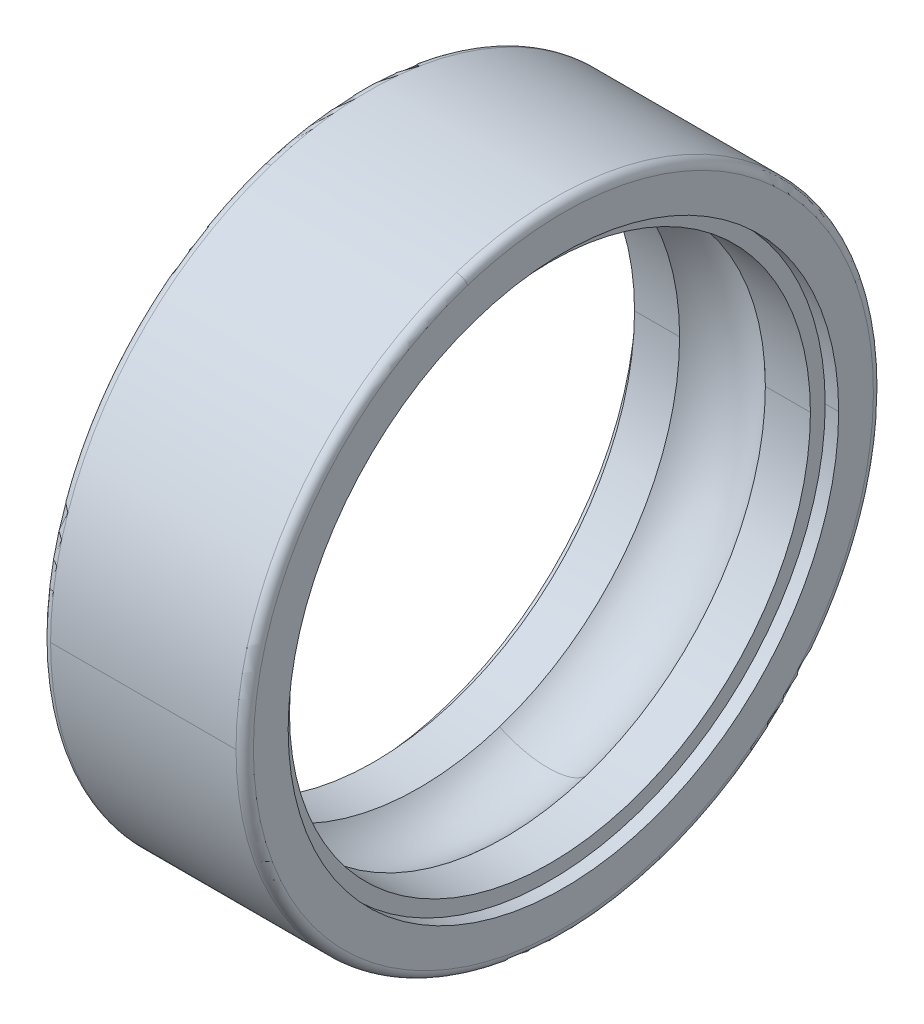
ISO-10303-21;
HEADER;
FILE_DESCRIPTION(('STEP AP214'),'2;1');
FILE_NAME('part.step','',(''),(''),'','','');
FILE_SCHEMA(('AUTOMOTIVE_DESIGN { 1 0 10303 214 1 1 1 1 }'));
ENDSEC;
DATA;
#1=APPLICATION_CONTEXT('core data for automotive mechanical design processes');
#2=APPLICATION_PROTOCOL_DEFINITION('international standard','automotive_design',2000,#1);
#3=PRODUCT_CONTEXT('',#1,'mechanical');
#4=PRODUCT('Part','Part','',(#3));
#5=PRODUCT_RELATED_PRODUCT_CATEGORY('part','',(#4));
#6=PRODUCT_DEFINITION_FORMATION('','',#4);
#7=PRODUCT_DEFINITION_CONTEXT('part definition',#1,'design');
#8=PRODUCT_DEFINITION('design','',#6,#7);
#9=PRODUCT_DEFINITION_SHAPE('','',#8);
#10=(LENGTH_UNIT() NAMED_UNIT(*) SI_UNIT(.MILLI.,.METRE.));
#11=(NAMED_UNIT(*) PLANE_ANGLE_UNIT() SI_UNIT($,.RADIAN.));
#12=(NAMED_UNIT(*) SI_UNIT($,.STERADIAN.) SOLID_ANGLE_UNIT());
#13=UNCERTAINTY_MEASURE_WITH_UNIT(LENGTH_MEASURE(1.E-05),#10,'distance_accuracy_value','');
#14=(GEOMETRIC_REPRESENTATION_CONTEXT(3) GLOBAL_UNCERTAINTY_ASSIGNED_CONTEXT((#13)) GLOBAL_UNIT_ASSIGNED_CONTEXT((#10,
#11,#12)) REPRESENTATION_CONTEXT('',''));
#15=CARTESIAN_POINT('',(0.,0.,0.));
#16=DIRECTION('',(0.,0.,1.));
#17=DIRECTION('',(1.,0.,0.));
#18=AXIS2_PLACEMENT_3D('',#15,#16,#17);
#19=CARTESIAN_POINT('',(0.,10.7,0.));
#20=DIRECTION('',(-1.,0.,0.));
#21=DIRECTION('',(0.,0.,1.));
#22=AXIS2_PLACEMENT_3D('',#19,#20,#21);
#23=PLANE('',#22);
#24=CARTESIAN_POINT('',(0.,0.,0.));
#25=DIRECTION('',(1.,0.,0.));
#26=DIRECTION('',(0.,0.,-1.));
#27=AXIS2_PLACEMENT_3D('',#24,#25,#26);
#28=CIRCLE('',#27,9.5);
#29=CARTESIAN_POINT('',(0.,0.,-9.5));
#30=VERTEX_POINT('',#29);
#31=CARTESIAN_POINT('',(0.,0.,9.5));
#32=VERTEX_POINT('',#31);
#33=EDGE_CURVE('E11',#30,#32,#28,.T.);
#34=ORIENTED_EDGE('',*,*,#33,.T.);
#35=CARTESIAN_POINT('',(0.,0.,0.));
#36=DIRECTION('',(1.,0.,0.));
#37=DIRECTION('',(0.,0.,-1.));
#38=AXIS2_PLACEMENT_3D('',#35,#36,#37);
#39=CIRCLE('',#38,9.5);
#40=EDGE_CURVE('E26',#32,#30,#39,.T.);
#41=ORIENTED_EDGE('',*,*,#40,.T.);
#42=EDGE_LOOP('',(#34,#41));
#43=FACE_BOUND('',#42,.T.);
#44=CARTESIAN_POINT('',(0.,10.1763047243581,3.30648183981196));
#45=CARTESIAN_POINT('',(0.,10.1222060192153,3.4729925522832));
#46=CARTESIAN_POINT('',(0.,10.0640137178569,3.63817284244062));
#47=CARTESIAN_POINT('',(0.,9.93959737326859,3.96548044496034));
#48=CARTESIAN_POINT('',(0.,9.87337333003879,4.12760775732264));
#49=CARTESIAN_POINT('',(0.,9.73304895226789,4.44841727108463));
#50=CARTESIAN_POINT('',(0.,9.65894861772679,4.60709947248432));
#51=CARTESIAN_POINT('',(0.,9.5030512671633,4.92063690146475));
#52=CARTESIAN_POINT('',(0.,9.42125425114093,5.07549212904549));
#53=CARTESIAN_POINT('',(0.,9.2501603002169,5.38100243898939));
#54=CARTESIAN_POINT('',(0.,9.16086336531526,5.53165752135256));
#55=CARTESIAN_POINT('',(0.,8.97498477943333,5.82840462947298));
#56=CARTESIAN_POINT('',(0.,8.87840312845304,5.97449665523024));
#57=CARTESIAN_POINT('',(0.,8.67818776299292,6.26176569364071));
#58=CARTESIAN_POINT('',(0.,8.57455404851308,6.40294270629393));
#59=CARTESIAN_POINT('',(0.,8.36048422439702,6.68004161285399));
#60=CARTESIAN_POINT('',(0.,8.25004811476079,6.81596350676083));
#61=CARTESIAN_POINT('',(0.,8.02263954907983,7.08222472750514));
#62=CARTESIAN_POINT('',(0.,7.90566709303509,7.2125640543426));
#63=CARTESIAN_POINT('',(0.,7.66546763183478,7.46734614224756));
#64=CARTESIAN_POINT('',(0.,7.5422406266792,7.59178890331505));
#65=CARTESIAN_POINT('',(0.,7.28982893179738,7.83447806612745));
#66=CARTESIAN_POINT('',(0.,7.16064424207114,7.95272446787235));
#67=CARTESIAN_POINT('',(0.,6.89662839530991,8.18273604611169));
#68=CARTESIAN_POINT('',(0.,6.76179723827492,8.29450122260611));
#69=CARTESIAN_POINT('',(0.,6.48681327695549,8.51128109824186));
#70=CARTESIAN_POINT('',(0.,6.34666047267106,8.61629579738319));
#71=CARTESIAN_POINT('',(0.,6.0613708572363,8.81932172870511));
#72=CARTESIAN_POINT('',(0.,5.91623404608597,8.91733296088571));
#73=CARTESIAN_POINT('',(0.,5.6213260642094,9.10611584064285));
#74=CARTESIAN_POINT('',(0.,5.47155489348316,9.19688748821941));
#75=CARTESIAN_POINT('',(0.,5.1677390043236,9.37097252191886));
#76=CARTESIAN_POINT('',(0.,5.01369428589029,9.45428590804176));
#77=CARTESIAN_POINT('',(0.,4.70170240853597,9.61325370958933));
#78=CARTESIAN_POINT('',(0.,4.54375524961497,9.688908125014));
#79=CARTESIAN_POINT('',(0.,4.22433899982567,9.83237572705182));
#80=CARTESIAN_POINT('',(0.,4.06286990895737,9.90018891366497));
#81=CARTESIAN_POINT('',(0.,3.73679878845639,10.0278106901734));
#82=CARTESIAN_POINT('',(0.,3.57219675882372,10.0876192800688));
#83=CARTESIAN_POINT('',(0.,3.24025630150081,10.19908777901));
#84=CARTESIAN_POINT('',(0.,3.07291787381057,10.2507476880558));
#85=CARTESIAN_POINT('',(0.,2.73590775330198,10.3457943720523));
#86=CARTESIAN_POINT('',(0.,2.56623606048361,10.3891811470029));
#87=CARTESIAN_POINT('',(0.,2.22496816368822,10.4675770402677));
#88=CARTESIAN_POINT('',(0.,2.0533719597112,10.502586158582));
#89=CARTESIAN_POINT('',(0.,1.70866843088395,10.5641423985417));
#90=CARTESIAN_POINT('',(0.,1.53556110603371,10.5906895201872));
#91=CARTESIAN_POINT('',(0.,1.18825236616799,10.635257812468));
#92=CARTESIAN_POINT('',(0.,1.01405095115252,10.6532789831034));
#93=CARTESIAN_POINT('',(0.,0.664973697423329,10.6807519587855));
#94=CARTESIAN_POINT('',(0.,0.490097858709621,10.6902037638323));
#95=CARTESIAN_POINT('',(0.,0.140093048796752,10.700515238111));
#96=CARTESIAN_POINT('',(0.,-0.0350359224024079,10.7013749073429));
#97=CARTESIAN_POINT('',(0.,-0.385125096255075,10.6945000389733));
#98=CARTESIAN_POINT('',(0.,-0.560085298908583,10.6867655013719));
#99=CARTESIAN_POINT('',(0.,-0.909415441217051,10.6627208525142));
#100=CARTESIAN_POINT('',(0.,-1.08378538087201,10.646410741258));
#101=CARTESIAN_POINT('',(0.,-1.43151492472575,10.6052542375774));
#102=CARTESIAN_POINT('',(0.,-1.60487452892453,10.580407845153));
#103=CARTESIAN_POINT('',(0.,-1.95016576339489,10.5222386362717));
#104=CARTESIAN_POINT('',(0.,-2.12209739366647,10.4889158198147));
#105=CARTESIAN_POINT('',(0.,-2.46411848192566,10.4138740404519));
#106=CARTESIAN_POINT('',(0.,-2.63420793991328,10.372155077546));
#107=CARTESIAN_POINT('',(0.,-2.97213492320218,10.2804215099211));
#108=CARTESIAN_POINT('',(0.,-3.13997244850347,10.230406905202));
#109=CARTESIAN_POINT('',(0.,-3.47299123112044,10.1222025435143));
#110=CARTESIAN_POINT('',(0.,-3.63817248843612,10.0640127865456));
#111=CARTESIAN_POINT('',(0.,-3.96548079896482,9.93959830457988));
#112=CARTESIAN_POINT('',(0.,-4.12760785217784,9.87337357958291));
#113=CARTESIAN_POINT('',(0.,-4.4484171762294,9.73304870272379));
#114=CARTESIAN_POINT('',(0.,-4.60709944706793,9.65894855086165));
#115=CARTESIAN_POINT('',(0.,-4.92063692688112,9.50305133402845));
#116=CARTESIAN_POINT('',(0.,-5.07549213585578,9.42125426905739));
#117=CARTESIAN_POINT('',(0.,-5.38100243217909,9.25016028230045));
#118=CARTESIAN_POINT('',(0.,-5.53165751952774,9.16086336051456));
#119=CARTESIAN_POINT('',(0.,-5.82840463129779,8.97498478423404));
#120=CARTESIAN_POINT('',(0.,-5.97449665571919,8.87840312973939));
#121=CARTESIAN_POINT('',(0.,-6.26176569315174,8.67818776170658));
#122=CARTESIAN_POINT('',(0.,-6.4029427061629,8.57455404816841));
#123=CARTESIAN_POINT('',(0.,-6.68004161298499,8.3604842247417));
#124=CARTESIAN_POINT('',(0.,-6.81596350679593,8.25004811485316));
#125=CARTESIAN_POINT('',(0.,-7.08222472747002,8.02263954898748));
#126=CARTESIAN_POINT('',(0.,-7.21256405433319,7.90566709301036));
#127=CARTESIAN_POINT('',(0.,-7.46734614225696,7.66546763185953));
#128=CARTESIAN_POINT('',(0.,-7.59178890331756,7.54224062668583));
#129=CARTESIAN_POINT('',(0.,-7.83447806612492,7.28982893179075));
#130=CARTESIAN_POINT('',(0.,-7.95272446787167,7.16064424206937));
#131=CARTESIAN_POINT('',(0.,-8.18273604611236,6.89662839531169));
#132=CARTESIAN_POINT('',(0.,-8.29450122260629,6.7617972382754));
#133=CARTESIAN_POINT('',(0.,-8.51128109824167,6.48681327695502));
#134=CARTESIAN_POINT('',(0.,-8.61629579738313,6.34666047267094));
#135=CARTESIAN_POINT('',(0.,-8.81932172870515,6.06137085723643));
#136=CARTESIAN_POINT('',(0.,-8.91733296088571,5.91623404608601));
#137=CARTESIAN_POINT('',(0.,-9.10611584064283,5.62132606420938));
#138=CARTESIAN_POINT('',(0.,-9.1968874882194,5.47155489348316));
#139=CARTESIAN_POINT('',(0.,-9.37097252191886,5.16773900432363));
#140=CARTESIAN_POINT('',(0.,-9.45428590804176,5.0136942858903));
#141=CARTESIAN_POINT('',(0.,-9.61325370958932,4.70170240853598));
#142=CARTESIAN_POINT('',(0.,-9.68890812501399,4.54375524961498));
#143=CARTESIAN_POINT('',(0.,-9.83237572705183,4.22433899982568));
#144=CARTESIAN_POINT('',(0.,-9.900188913665,4.06286990895737));
#145=CARTESIAN_POINT('',(0.,-10.0278106901734,3.73679878845641));
#146=CARTESIAN_POINT('',(0.,-10.0876192800686,3.57219675882376));
#147=CARTESIAN_POINT('',(0.,-10.1990877790101,3.24025630150078));
#148=CARTESIAN_POINT('',(0.,-10.2507476880563,3.07291787381045));
#149=CARTESIAN_POINT('',(0.,-10.3457943720518,2.73590775330212));
#150=CARTESIAN_POINT('',(0.,-10.389181147001,2.56623606048412));
#151=CARTESIAN_POINT('',(0.,-10.4675770402695,2.22496816368773));
#152=CARTESIAN_POINT('',(0.,-10.5025861585888,2.05337195970936));
#153=CARTESIAN_POINT('',(0.,-10.5641423985349,1.70866843088582));
#154=CARTESIAN_POINT('',(0.,-10.5906895201616,1.53556110604065));
#155=CARTESIAN_POINT('',(0.,-10.6352578124936,1.18825236616106));
#156=CARTESIAN_POINT('',(0.,-10.6532789831988,1.01405095112664));
#157=CARTESIAN_POINT('',(0.,-10.6807519586902,0.66497369744922));
#158=CARTESIAN_POINT('',(0.,-10.6902037634764,0.49009785880623));
#159=CARTESIAN_POINT('',(0.,-10.7005152384668,0.140093048700162));
#160=CARTESIAN_POINT('',(0.,-10.7013749086709,-0.0350359227629166));
#161=CARTESIAN_POINT('',(0.,-10.6945000376453,-0.385125095894546));
#162=CARTESIAN_POINT('',(0.,-10.6867654964154,-0.560085297563097));
#163=CARTESIAN_POINT('',(0.,-10.6627208574707,-0.909415442562518));
#164=CARTESIAN_POINT('',(0.,-10.6464107597557,-1.08378538589339));
#165=CARTESIAN_POINT('',(0.,-10.6052542190797,-1.43151491970436));
#166=CARTESIAN_POINT('',(0.,-10.5804077761186,-1.60487451018446));
#167=CARTESIAN_POINT('',(0.,-10.5222387053061,-1.95016578213494));
#168=CARTESIAN_POINT('',(0.,-10.4889160774547,-2.12209746360532));
#169=CARTESIAN_POINT('',(0.,-10.413873782812,-2.46411841198679));
#170=CARTESIAN_POINT('',(0.,-10.3721541160207,-2.63420767889787));
#171=CARTESIAN_POINT('',(0.,-10.2804224714464,-2.97213518421757));
#172=CARTESIAN_POINT('',(0.,-10.2304104936632,-3.13997342262617));
#173=CARTESIAN_POINT('',(0.,-10.1763047243581,-3.30648183981194));
#174=B_SPLINE_CURVE_WITH_KNOTS('',3,(#44,#45,#46,#47,#48,#49,#50,#51,#52,#53,#54,#55,#56,#57,
#58,#59,#60,#61,#62,#63,#64,#65,#66,#67,#68,#69,#70,#71,#72,#73,#74,#75,#76,#77,#78,#79,#80,#81,
#82,#83,#84,#85,#86,#87,#88,#89,#90,#91,#92,#93,#94,#95,#96,#97,#98,#99,#100,#101,#102,#103,
#104,#105,#106,#107,#108,#109,#110,#111,#112,#113,#114,#115,#116,#117,#118,#119,#120,#121,#122,
#123,#124,#125,#126,#127,#128,#129,#130,#131,#132,#133,#134,#135,#136,#137,#138,#139,#140,#141,
#142,#143,#144,#145,#146,#147,#148,#149,#150,#151,#152,#153,#154,#155,#156,#157,#158,#159,#160,
#161,#162,#163,#164,#165,#166,#167,#168,#169,#170,#171,#172,#173),.UNSPECIFIED.,.F.,.F.,(4,2,2,
2,2,2,2,2,2,2,2,2,2,2,2,2,2,2,2,2,2,2,2,2,2,2,2,2,2,2,2,2,2,2,2,2,2,2,2,2,2,2,2,2,2,2,2,2,2,2,2,
2,2,2,2,2,2,2,2,2,2,2,2,2,4),(0.,0.52518229039032,1.05036458078064,1.57554687117097,
2.10072916156129,2.62591145195161,3.15109374234194,3.67627603273226,4.20145832312258,
4.7266406135129,5.25182290390323,5.77700519429355,6.30218748468387,6.82736977507419,
7.35255206546451,7.87773435585484,8.40291664624516,8.92809893663548,9.4532812270258,
9.97846351741613,10.5036458078064,11.0288280981968,11.5540103885871,12.0791926789774,
12.6043749693677,13.1295572597581,13.6547395501484,14.1799218405387,14.705104130929,
15.2302864213194,15.7554687117097,16.2806510021,16.8058332924903,17.3310155828806,
17.856197873271,18.3813801636613,18.9065624540516,19.4317447444419,19.9569270348323,
20.4821093252226,21.0072916156129,21.5324739060032,22.0576561963935,22.5828384867839,
23.1080207771742,23.6332030675645,24.1583853579548,24.6835676483452,25.2087499387355,
25.7339322291258,26.2591145195161,26.7842968099065,27.3094791002968,27.8346613906871,
28.3598436810774,28.8850259714678,29.4102082618581,29.9353905522484,30.4605728426387,
30.985755133029,31.5109374234194,32.0361197138097,32.5613020042,33.0864842945903,
33.6116665849807),.UNSPECIFIED.);
#175=CARTESIAN_POINT('',(0.,10.1763047243581,3.30648183981194));
#176=VERTEX_POINT('',#175);
#177=CARTESIAN_POINT('',(0.,-10.1763047243581,-3.30648183981193));
#178=VERTEX_POINT('',#177);
#179=EDGE_CURVE('E318',#176,#178,#174,.T.);
#180=ORIENTED_EDGE('',*,*,#179,.F.);
#181=CARTESIAN_POINT('',(0.,-10.1763047243581,-3.30648183981196));
#182=CARTESIAN_POINT('',(0.,-10.1222060192153,-3.4729925522832));
#183=CARTESIAN_POINT('',(0.,-10.0640137178569,-3.63817284244062));
#184=CARTESIAN_POINT('',(0.,-9.93959737326859,-3.96548044496034));
#185=CARTESIAN_POINT('',(0.,-9.87337333003879,-4.12760775732264));
#186=CARTESIAN_POINT('',(0.,-9.73304895226789,-4.44841727108463));
#187=CARTESIAN_POINT('',(0.,-9.65894861772679,-4.60709947248432));
#188=CARTESIAN_POINT('',(0.,-9.50305126716331,-4.92063690146475));
#189=CARTESIAN_POINT('',(0.,-9.42125425114093,-5.07549212904549));
#190=CARTESIAN_POINT('',(0.,-9.2501603002169,-5.38100243898939));
#191=CARTESIAN_POINT('',(0.,-9.16086336531526,-5.53165752135256));
#192=CARTESIAN_POINT('',(0.,-8.97498477943333,-5.82840462947298));
#193=CARTESIAN_POINT('',(0.,-8.87840312845305,-5.97449665523023));
#194=CARTESIAN_POINT('',(0.,-8.67818776299292,-6.2617656936407));
#195=CARTESIAN_POINT('',(0.,-8.57455404851308,-6.40294270629392));
#196=CARTESIAN_POINT('',(0.,-8.36048422439702,-6.68004161285398));
#197=CARTESIAN_POINT('',(0.,-8.2500481147608,-6.81596350676083));
#198=CARTESIAN_POINT('',(0.,-8.02263954907984,-7.08222472750514));
#199=CARTESIAN_POINT('',(0.,-7.9056670930351,-7.2125640543426));
#200=CARTESIAN_POINT('',(0.,-7.66546763183478,-7.46734614224755));
#201=CARTESIAN_POINT('',(0.,-7.5422406266792,-7.59178890331504));
#202=CARTESIAN_POINT('',(0.,-7.28982893179738,-7.83447806612744));
#203=CARTESIAN_POINT('',(0.,-7.16064424207114,-7.95272446787235));
#204=CARTESIAN_POINT('',(0.,-6.89662839530992,-8.18273604611168));
#205=CARTESIAN_POINT('',(0.,-6.76179723827492,-8.2945012226061));
#206=CARTESIAN_POINT('',(0.,-6.4868132769555,-8.51128109824185));
#207=CARTESIAN_POINT('',(0.,-6.34666047267107,-8.61629579738318));
#208=CARTESIAN_POINT('',(0.,-6.06137085723631,-8.81932172870511));
#209=CARTESIAN_POINT('',(0.,-5.91623404608598,-8.9173329608857));
#210=CARTESIAN_POINT('',(0.,-5.62132606420941,-9.10611584064285));
#211=CARTESIAN_POINT('',(0.,-5.47155489348317,-9.1968874882194));
#212=CARTESIAN_POINT('',(0.,-5.16773900432361,-9.37097252191885));
#213=CARTESIAN_POINT('',(0.,-5.0136942858903,-9.45428590804176));
#214=CARTESIAN_POINT('',(0.,-4.70170240853598,-9.61325370958933));
#215=CARTESIAN_POINT('',(0.,-4.54375524961498,-9.688908125014));
#216=CARTESIAN_POINT('',(0.,-4.22433899982568,-9.83237572705182));
#217=CARTESIAN_POINT('',(0.,-4.06286990895738,-9.90018891366496));
#218=CARTESIAN_POINT('',(0.,-3.7367987884564,-10.0278106901734));
#219=CARTESIAN_POINT('',(0.,-3.57219675882373,-10.0876192800688));
#220=CARTESIAN_POINT('',(0.,-3.24025630150082,-10.19908777901));
#221=CARTESIAN_POINT('',(0.,-3.07291787381059,-10.2507476880558));
#222=CARTESIAN_POINT('',(0.,-2.73590775330199,-10.3457943720523));
#223=CARTESIAN_POINT('',(0.,-2.56623606048362,-10.3891811470029));
#224=CARTESIAN_POINT('',(0.,-2.22496816368823,-10.4675770402677));
#225=CARTESIAN_POINT('',(0.,-2.05337195971121,-10.502586158582));
#226=CARTESIAN_POINT('',(0.,-1.70866843088396,-10.5641423985417));
#227=CARTESIAN_POINT('',(0.,-1.53556110603372,-10.5906895201872));
#228=CARTESIAN_POINT('',(0.,-1.18825236616801,-10.635257812468));
#229=CARTESIAN_POINT('',(0.,-1.01405095115253,-10.6532789831034));
#230=CARTESIAN_POINT('',(0.,-0.664973697423343,-10.6807519587855));
#231=CARTESIAN_POINT('',(0.,-0.490097858709633,-10.6902037638323));
#232=CARTESIAN_POINT('',(0.,-0.140093048796764,-10.700515238111));
#233=CARTESIAN_POINT('',(0.,0.035035922402394,-10.7013749073429));
#234=CARTESIAN_POINT('',(0.,0.38512509625506,-10.6945000389733));
#235=CARTESIAN_POINT('',(0.,0.560085298908567,-10.6867655013719));
#236=CARTESIAN_POINT('',(0.,0.909415441217034,-10.6627208525142));
#237=CARTESIAN_POINT('',(0.,1.08378538087199,-10.646410741258));
#238=CARTESIAN_POINT('',(0.,1.43151492472573,-10.6052542375774));
#239=CARTESIAN_POINT('',(0.,1.60487452892451,-10.580407845153));
#240=CARTESIAN_POINT('',(0.,1.95016576339487,-10.5222386362717));
#241=CARTESIAN_POINT('',(0.,2.12209739366645,-10.4889158198147));
#242=CARTESIAN_POINT('',(0.,2.46411848192564,-10.4138740404519));
#243=CARTESIAN_POINT('',(0.,2.63420793991326,-10.372155077546));
#244=CARTESIAN_POINT('',(0.,2.97213492320216,-10.2804215099211));
#245=CARTESIAN_POINT('',(0.,3.13997244850345,-10.230406905202));
#246=CARTESIAN_POINT('',(0.,3.47299123112042,-10.1222025435143));
#247=CARTESIAN_POINT('',(0.,3.6381724884361,-10.0640127865456));
#248=CARTESIAN_POINT('',(0.,3.9654807989648,-9.93959830457989));
#249=CARTESIAN_POINT('',(0.,4.12760785217782,-9.87337357958291));
#250=CARTESIAN_POINT('',(0.,4.44841717622938,-9.7330487027238));
#251=CARTESIAN_POINT('',(0.,4.60709944706791,-9.65894855086166));
#252=CARTESIAN_POINT('',(0.,4.9206369268811,-9.50305133402846));
#253=CARTESIAN_POINT('',(0.,5.07549213585576,-9.4212542690574));
#254=CARTESIAN_POINT('',(0.,5.38100243217907,-9.25016028230046));
#255=CARTESIAN_POINT('',(0.,5.53165751952772,-9.16086336051458));
#256=CARTESIAN_POINT('',(0.,5.82840463129777,-8.97498478423405));
#257=CARTESIAN_POINT('',(0.,5.97449665571916,-8.87840312973941));
#258=CARTESIAN_POINT('',(0.,6.26176569315172,-8.67818776170659));
#259=CARTESIAN_POINT('',(0.,6.40294270616288,-8.57455404816842));
#260=CARTESIAN_POINT('',(0.,6.68004161298497,-8.36048422474171));
#261=CARTESIAN_POINT('',(0.,6.81596350679591,-8.25004811485317));
#262=CARTESIAN_POINT('',(0.,7.08222472747001,-8.0226395489875));
#263=CARTESIAN_POINT('',(0.,7.21256405433317,-7.90566709301037));
#264=CARTESIAN_POINT('',(0.,7.46734614225694,-7.66546763185954));
#265=CARTESIAN_POINT('',(0.,7.59178890331754,-7.54224062668585));
#266=CARTESIAN_POINT('',(0.,7.8344780661249,-7.28982893179077));
#267=CARTESIAN_POINT('',(0.,7.95272446787165,-7.16064424206939));
#268=CARTESIAN_POINT('',(0.,8.18273604611234,-6.89662839531171));
#269=CARTESIAN_POINT('',(0.,8.29450122260627,-6.76179723827542));
#270=CARTESIAN_POINT('',(0.,8.51128109824166,-6.48681327695505));
#271=CARTESIAN_POINT('',(0.,8.61629579738312,-6.34666047267096));
#272=CARTESIAN_POINT('',(0.,8.81932172870514,-6.06137085723646));
#273=CARTESIAN_POINT('',(0.,8.9173329608857,-5.91623404608604));
#274=CARTESIAN_POINT('',(0.,9.10611584064282,-5.6213260642094));
#275=CARTESIAN_POINT('',(0.,9.19688748821938,-5.47155489348319));
#276=CARTESIAN_POINT('',(0.,9.37097252191884,-5.16773900432365));
#277=CARTESIAN_POINT('',(0.,9.45428590804174,-5.01369428589033));
#278=CARTESIAN_POINT('',(0.,9.61325370958931,-4.70170240853601));
#279=CARTESIAN_POINT('',(0.,9.68890812501398,-4.54375524961501));
#280=CARTESIAN_POINT('',(0.,9.83237572705182,-4.2243389998257));
#281=CARTESIAN_POINT('',(0.,9.90018891366499,-4.06286990895739));
#282=CARTESIAN_POINT('',(0.,10.0278106901734,-3.73679878845644));
#283=CARTESIAN_POINT('',(0.,10.0876192800686,-3.57219675882379));
#284=CARTESIAN_POINT('',(0.,10.1990877790101,-3.24025630150081));
#285=CARTESIAN_POINT('',(0.,10.2507476880563,-3.07291787381048));
#286=CARTESIAN_POINT('',(0.,10.3457943720518,-2.73590775330215));
#287=CARTESIAN_POINT('',(0.,10.389181147001,-2.56623606048414));
#288=CARTESIAN_POINT('',(0.,10.4675770402695,-2.22496816368776));
#289=CARTESIAN_POINT('',(0.,10.5025861585888,-2.05337195970938));
#290=CARTESIAN_POINT('',(0.,10.5641423985349,-1.70866843088585));
#291=CARTESIAN_POINT('',(0.,10.5906895201616,-1.53556110604069));
#292=CARTESIAN_POINT('',(0.,10.6352578124936,-1.1882523661611));
#293=CARTESIAN_POINT('',(0.,10.6532789831988,-1.01405095112668));
#294=CARTESIAN_POINT('',(0.,10.6807519586902,-0.66497369744926));
#295=CARTESIAN_POINT('',(0.,10.6902037634764,-0.490097858806269));
#296=CARTESIAN_POINT('',(0.,10.7005152384668,-0.140093048700201));
#297=CARTESIAN_POINT('',(0.,10.7013749086709,0.0350359227628772));
#298=CARTESIAN_POINT('',(0.,10.6945000376453,0.385125095894506));
#299=CARTESIAN_POINT('',(0.,10.6867654964154,0.560085297563057));
#300=CARTESIAN_POINT('',(0.,10.6627208574707,0.909415442562479));
#301=CARTESIAN_POINT('',(0.,10.6464107597557,1.08378538589335));
#302=CARTESIAN_POINT('',(0.,10.6052542190797,1.43151491970432));
#303=CARTESIAN_POINT('',(0.,10.5804077761186,1.60487451018442));
#304=CARTESIAN_POINT('',(0.,10.5222387053061,1.9501657821349));
#305=CARTESIAN_POINT('',(0.,10.4889160774547,2.12209746360528));
#306=CARTESIAN_POINT('',(0.,10.413873782812,2.46411841198675));
#307=CARTESIAN_POINT('',(0.,10.3721541160208,2.63420767889784));
#308=CARTESIAN_POINT('',(0.,10.2804224714464,2.97213518421753));
#309=CARTESIAN_POINT('',(0.,10.2304104936632,3.13997342262613));
#310=CARTESIAN_POINT('',(0.,10.1763047243582,3.30648183981191));
#311=B_SPLINE_CURVE_WITH_KNOTS('',3,(#181,#182,#183,#184,#185,#186,#187,#188,#189,#190,#191,
#192,#193,#194,#195,#196,#197,#198,#199,#200,#201,#202,#203,#204,#205,#206,#207,#208,#209,#210,
#211,#212,#213,#214,#215,#216,#217,#218,#219,#220,#221,#222,#223,#224,#225,#226,#227,#228,#229,
#230,#231,#232,#233,#234,#235,#236,#237,#238,#239,#240,#241,#242,#243,#244,#245,#246,#247,#248,
#249,#250,#251,#252,#253,#254,#255,#256,#257,#258,#259,#260,#261,#262,#263,#264,#265,#266,#267,
#268,#269,#270,#271,#272,#273,#274,#275,#276,#277,#278,#279,#280,#281,#282,#283,#284,#285,#286,
#287,#288,#289,#290,#291,#292,#293,#294,#295,#296,#297,#298,#299,#300,#301,#302,#303,#304,#305,
#306,#307,#308,#309,#310),.UNSPECIFIED.,.F.,.F.,(4,2,2,2,2,2,2,2,2,2,2,2,2,2,2,2,2,2,2,2,2,2,2,
2,2,2,2,2,2,2,2,2,2,2,2,2,2,2,2,2,2,2,2,2,2,2,2,2,2,2,2,2,2,2,2,2,2,2,2,2,2,2,2,2,4),(0.,
0.52518229039032,1.05036458078064,1.57554687117097,2.10072916156129,2.62591145195161,
3.15109374234193,3.67627603273225,4.20145832312258,4.7266406135129,5.25182290390322,
5.77700519429354,6.30218748468386,6.82736977507418,7.35255206546451,7.87773435585483,
8.40291664624515,8.92809893663547,9.4532812270258,9.97846351741612,10.5036458078064,
11.0288280981968,11.5540103885871,12.0791926789774,12.6043749693677,13.1295572597581,
13.6547395501484,14.1799218405387,14.705104130929,15.2302864213193,15.7554687117097,
16.2806510021,16.8058332924903,17.3310155828806,17.856197873271,18.3813801636613,
18.9065624540516,19.4317447444419,19.9569270348322,20.4821093252226,21.0072916156129,
21.5324739060032,22.0576561963935,22.5828384867838,23.1080207771742,23.6332030675645,
24.1583853579548,24.6835676483451,25.2087499387355,25.7339322291258,26.2591145195161,
26.7842968099064,27.3094791002968,27.8346613906871,28.3598436810774,28.8850259714677,
29.410208261858,29.9353905522484,30.4605728426387,30.985755133029,31.5109374234193,
32.0361197138097,32.5613020042,33.0864842945903,33.6116665849806),.UNSPECIFIED.);
#312=EDGE_CURVE('E420',#178,#176,#311,.T.);
#313=ORIENTED_EDGE('',*,*,#312,.F.);
#314=EDGE_LOOP('',(#180,#313));
#315=FACE_BOUND('',#314,.T.);
#316=ADVANCED_FACE('F17',(#43,#315),#23,.T.);
#317=CARTESIAN_POINT('',(0.299999999999936,0.,0.));
#318=DIRECTION('',(1.,0.,0.));
#319=DIRECTION('',(0.,-0.309016994374947,0.951056516295154));
#320=AXIS2_PLACEMENT_3D('',#317,#318,#319);
#321=TOROIDAL_SURFACE('',#320,10.7,0.299999999999936);
#322=CARTESIAN_POINT('',(0.299999999999936,-10.1763047243581,-3.30648183981193));
#323=DIRECTION('',(0.,0.309016994374948,-0.951056516295154));
#324=DIRECTION('',(2.11682523361907E-13,-0.951056516295154,-0.309016994374948));
#325=AXIS2_PLACEMENT_3D('',#322,#323,#324);
#326=CIRCLE('',#325,0.299999999999937);
#327=CARTESIAN_POINT('',(0.3,-10.4616216792466,-3.3991869381244));
#328=VERTEX_POINT('',#327);
#329=EDGE_CURVE('E383',#328,#178,#326,.T.);
#330=ORIENTED_EDGE('',*,*,#329,.T.);
#331=ORIENTED_EDGE('',*,*,#312,.T.);
#332=CARTESIAN_POINT('',(0.299999999999936,10.1763047243581,3.30648183981194));
#333=DIRECTION('',(0.,-0.309016994374948,0.951056516295154));
#334=DIRECTION('',(2.11682523361907E-13,0.951056516295154,0.309016994374948));
#335=AXIS2_PLACEMENT_3D('',#332,#333,#334);
#336=CIRCLE('',#335,0.299999999999937);
#337=CARTESIAN_POINT('',(0.3,10.4616216792466,3.3991869381244));
#338=VERTEX_POINT('',#337);
#339=EDGE_CURVE('E379',#338,#176,#336,.T.);
#340=ORIENTED_EDGE('',*,*,#339,.F.);
#341=CARTESIAN_POINT('',(0.3,0.,0.));
#342=DIRECTION('',(1.,0.,0.));
#343=DIRECTION('',(0.,0.,-1.));
#344=AXIS2_PLACEMENT_3D('',#341,#342,#343);
#345=CIRCLE('',#344,11.);
#346=CARTESIAN_POINT('',(0.3,0.,-11.));
#347=VERTEX_POINT('',#346);
#348=EDGE_CURVE('E374',#347,#338,#345,.T.);
#349=ORIENTED_EDGE('',*,*,#348,.F.);
#350=CARTESIAN_POINT('',(0.3,0.,0.));
#351=DIRECTION('',(1.,0.,0.));
#352=DIRECTION('',(0.,0.,-1.));
#353=AXIS2_PLACEMENT_3D('',#350,#351,#352);
#354=CIRCLE('',#353,11.);
#355=EDGE_CURVE('E369',#328,#347,#354,.T.);
#356=ORIENTED_EDGE('',*,*,#355,.F.);
#357=EDGE_LOOP('',(#330,#331,#340,#349,#356));
#358=FACE_BOUND('',#357,.T.);
#359=ADVANCED_FACE('F391',(#358),#321,.T.);
#360=CARTESIAN_POINT('',(7.,0.,0.));
#361=DIRECTION('',(1.,0.,0.));
#362=DIRECTION('',(0.,1.,0.));
#363=AXIS2_PLACEMENT_3D('',#360,#361,#362);
#364=CYLINDRICAL_SURFACE('',#363,11.);
#365=DIRECTION('',(1.,0.,0.));
#366=VECTOR('',#365,1.);
#367=CARTESIAN_POINT('',(0.3,0.,11.));
#368=LINE('',#367,#366);
#369=CARTESIAN_POINT('',(0.3,0.,11.));
#370=VERTEX_POINT('',#369);
#371=CARTESIAN_POINT('',(6.7,0.,11.));
#372=VERTEX_POINT('',#371);
#373=EDGE_CURVE('E364',#370,#372,#368,.T.);
#374=ORIENTED_EDGE('',*,*,#373,.F.);
#375=CARTESIAN_POINT('',(0.3,0.,0.));
#376=DIRECTION('',(1.,0.,0.));
#377=DIRECTION('',(0.,0.,-1.));
#378=AXIS2_PLACEMENT_3D('',#375,#376,#377);
#379=CIRCLE('',#378,11.);
#380=EDGE_CURVE('E359',#370,#328,#379,.T.);
#381=ORIENTED_EDGE('',*,*,#380,.T.);
#382=ORIENTED_EDGE('',*,*,#355,.T.);
#383=DIRECTION('',(1.,0.,0.));
#384=VECTOR('',#383,1.);
#385=CARTESIAN_POINT('',(0.3,0.,-11.));
#386=LINE('',#385,#384);
#387=CARTESIAN_POINT('',(6.7,0.,-11.));
#388=VERTEX_POINT('',#387);
#389=EDGE_CURVE('E355',#347,#388,#386,.T.);
#390=ORIENTED_EDGE('',*,*,#389,.T.);
#391=CARTESIAN_POINT('',(6.7,0.,0.));
#392=DIRECTION('',(1.,0.,0.));
#393=DIRECTION('',(0.,0.,-1.));
#394=AXIS2_PLACEMENT_3D('',#391,#392,#393);
#395=CIRCLE('',#394,11.);
#396=CARTESIAN_POINT('',(6.7,-10.4616216792467,-3.39918693812442));
#397=VERTEX_POINT('',#396);
#398=EDGE_CURVE('E350',#397,#388,#395,.T.);
#399=ORIENTED_EDGE('',*,*,#398,.F.);
#400=CARTESIAN_POINT('',(6.7,0.,0.));
#401=DIRECTION('',(1.,0.,0.));
#402=DIRECTION('',(0.,0.,-1.));
#403=AXIS2_PLACEMENT_3D('',#400,#401,#402);
#404=CIRCLE('',#403,11.);
#405=EDGE_CURVE('E345',#372,#397,#404,.T.);
#406=ORIENTED_EDGE('',*,*,#405,.F.);
#407=EDGE_LOOP('',(#374,#381,#382,#390,#399,#406));
#408=FACE_BOUND('',#407,.T.);
#409=ADVANCED_FACE('F400',(#408),#364,.T.);
#410=CARTESIAN_POINT('',(6.70000000000013,0.,0.));
#411=DIRECTION('',(1.,0.,0.));
#412=DIRECTION('',(0.,0.309016994374947,-0.951056516295154));
#413=AXIS2_PLACEMENT_3D('',#410,#411,#412);
#414=TOROIDAL_SURFACE('',#413,10.7000000000001,0.299999999999875);
#415=CARTESIAN_POINT('',(6.70000000000013,-10.1763047243583,-3.30648183981197));
#416=DIRECTION('',(0.,0.309016994374947,-0.951056516295154));
#417=DIRECTION('',(1.,0.,0.));
#418=AXIS2_PLACEMENT_3D('',#415,#416,#417);
#419=CIRCLE('',#418,0.299999999999875);
#420=CARTESIAN_POINT('',(7.00000000000001,-10.1763047243583,-3.30648183981197));
#421=VERTEX_POINT('',#420);
#422=EDGE_CURVE('E341',#421,#397,#419,.T.);
#423=ORIENTED_EDGE('',*,*,#422,.F.);
#424=CARTESIAN_POINT('',(7.,0.,0.));
#425=DIRECTION('',(1.,0.,0.));
#426=DIRECTION('',(0.,0.,-1.));
#427=AXIS2_PLACEMENT_3D('',#424,#425,#426);
#428=CIRCLE('',#427,10.7);
#429=CARTESIAN_POINT('',(7.00000000000001,10.1763047243583,3.30648183981197));
#430=VERTEX_POINT('',#429);
#431=EDGE_CURVE('E336',#430,#421,#428,.T.);
#432=ORIENTED_EDGE('',*,*,#431,.F.);
#433=CARTESIAN_POINT('',(6.70000000000013,10.1763047243583,3.30648183981197));
#434=DIRECTION('',(0.,-0.309016994374947,0.951056516295154));
#435=DIRECTION('',(1.,0.,0.));
#436=AXIS2_PLACEMENT_3D('',#433,#434,#435);
#437=CIRCLE('',#436,0.299999999999875);
#438=CARTESIAN_POINT('',(6.7,10.4616216792467,3.39918693812442));
#439=VERTEX_POINT('',#438);
#440=EDGE_CURVE('E332',#430,#439,#437,.T.);
#441=ORIENTED_EDGE('',*,*,#440,.T.);
#442=CARTESIAN_POINT('',(6.7,0.,0.));
#443=DIRECTION('',(1.,0.,0.));
#444=DIRECTION('',(0.,0.,-1.));
#445=AXIS2_PLACEMENT_3D('',#442,#443,#444);
#446=CIRCLE('',#445,11.);
#447=EDGE_CURVE('E327',#439,#372,#446,.T.);
#448=ORIENTED_EDGE('',*,*,#447,.T.);
#449=ORIENTED_EDGE('',*,*,#405,.T.);
#450=EDGE_LOOP('',(#423,#432,#441,#448,#449));
#451=FACE_BOUND('',#450,.T.);
#452=ADVANCED_FACE('F404',(#451),#414,.T.);
#453=CARTESIAN_POINT('',(7.,0.,0.));
#454=DIRECTION('',(1.,0.,0.));
#455=DIRECTION('',(0.,-1.,0.));
#456=AXIS2_PLACEMENT_3D('',#453,#454,#455);
#457=CYLINDRICAL_SURFACE('',#456,11.);
#458=ORIENTED_EDGE('',*,*,#373,.T.);
#459=ORIENTED_EDGE('',*,*,#447,.F.);
#460=CARTESIAN_POINT('',(6.7,0.,0.));
#461=DIRECTION('',(1.,0.,0.));
#462=DIRECTION('',(0.,0.,-1.));
#463=AXIS2_PLACEMENT_3D('',#460,#461,#462);
#464=CIRCLE('',#463,11.);
#465=EDGE_CURVE('E322',#388,#439,#464,.T.);
#466=ORIENTED_EDGE('',*,*,#465,.F.);
#467=ORIENTED_EDGE('',*,*,#389,.F.);
#468=ORIENTED_EDGE('',*,*,#348,.T.);
#469=CARTESIAN_POINT('',(0.3,0.,0.));
#470=DIRECTION('',(1.,0.,0.));
#471=DIRECTION('',(0.,0.,-1.));
#472=AXIS2_PLACEMENT_3D('',#469,#470,#471);
#473=CIRCLE('',#472,11.);
#474=EDGE_CURVE('E319',#338,#370,#473,.T.);
#475=ORIENTED_EDGE('',*,*,#474,.T.);
#476=EDGE_LOOP('',(#458,#459,#466,#467,#468,#475));
#477=FACE_BOUND('',#476,.T.);
#478=ADVANCED_FACE('F407',(#477),#457,.T.);
#479=CARTESIAN_POINT('',(0.299999999999936,0.,0.));
#480=DIRECTION('',(1.,0.,0.));
#481=DIRECTION('',(0.,0.309016994374947,-0.951056516295154));
#482=AXIS2_PLACEMENT_3D('',#479,#480,#481);
#483=TOROIDAL_SURFACE('',#482,10.7,0.299999999999936);
#484=ORIENTED_EDGE('',*,*,#329,.F.);
#485=ORIENTED_EDGE('',*,*,#380,.F.);
#486=ORIENTED_EDGE('',*,*,#474,.F.);
#487=ORIENTED_EDGE('',*,*,#339,.T.);
#488=ORIENTED_EDGE('',*,*,#179,.T.);
#489=EDGE_LOOP('',(#484,#485,#486,#487,#488));
#490=FACE_BOUND('',#489,.T.);
#491=ADVANCED_FACE('F289',(#490),#483,.T.);
#492=CARTESIAN_POINT('',(6.70000000000013,0.,0.));
#493=DIRECTION('',(1.,0.,0.));
#494=DIRECTION('',(0.,-0.309016994374947,0.951056516295154));
#495=AXIS2_PLACEMENT_3D('',#492,#493,#494);
#496=TOROIDAL_SURFACE('',#495,10.7000000000001,0.299999999999875);
#497=ORIENTED_EDGE('',*,*,#422,.T.);
#498=ORIENTED_EDGE('',*,*,#398,.T.);
#499=ORIENTED_EDGE('',*,*,#465,.T.);
#500=ORIENTED_EDGE('',*,*,#440,.F.);
#501=CARTESIAN_POINT('',(7.,-10.1763047243581,-3.30648183981194));
#502=CARTESIAN_POINT('',(7.,-9.65690267624749,-4.90495709132963));
#503=CARTESIAN_POINT('',(7.,-8.82377001746347,-6.4015449288719));
#504=CARTESIAN_POINT('',(7.,-7.70303591347207,-7.71368525089797));
#505=CARTESIAN_POINT('',(7.,-5.00749251702068,-9.82775367064837));
#506=CARTESIAN_POINT('',(7.,-1.71277244133918,-10.7658866430674));
#507=CARTESIAN_POINT('',(7.,0.00753062996819778,-10.9012803646003));
#508=CARTESIAN_POINT('',(7.,3.40843865374229,-10.4900955320945));
#509=CARTESIAN_POINT('',(7.,6.40151942179496,-8.82374746864334));
#510=CARTESIAN_POINT('',(7.,7.713691409188,-7.70304287220367));
#511=CARTESIAN_POINT('',(7.,9.82775521624545,-5.00748948361563));
#512=CARTESIAN_POINT('',(7.,10.7658773935832,-1.71277154941768));
#513=CARTESIAN_POINT('',(7.,10.9013135996627,0.00752324817339112));
#514=CARTESIAN_POINT('',(7.,10.6956598195201,1.7079913323564));
#515=CARTESIAN_POINT('',(7.,10.1763047243581,3.30648183981193));
#516=B_SPLINE_CURVE_WITH_KNOTS('',5,(#501,#502,#503,#504,#505,#506,#507,#508,#509,#510,#511,
#512,#513,#514,#515),.UNSPECIFIED.,.F.,.F.,(6,3,3,3,6),(0.,0.785398163397448,1.5707963267949,
2.35619449019234,3.14159265358979),.UNSPECIFIED.);
#517=EDGE_CURVE('E263',#421,#430,#516,.T.);
#518=ORIENTED_EDGE('',*,*,#517,.F.);
#519=EDGE_LOOP('',(#497,#498,#499,#500,#518));
#520=FACE_BOUND('',#519,.T.);
#521=ADVANCED_FACE('F283',(#520),#496,.T.);
#522=CARTESIAN_POINT('',(7.,9.5,0.));
#523=DIRECTION('',(1.,0.,0.));
#524=DIRECTION('',(0.,0.,-1.));
#525=AXIS2_PLACEMENT_3D('',#522,#523,#524);
#526=PLANE('',#525);
#527=ORIENTED_EDGE('',*,*,#431,.T.);
#528=ORIENTED_EDGE('',*,*,#517,.T.);
#529=EDGE_LOOP('',(#527,#528));
#530=FACE_BOUND('',#529,.T.);
#531=CARTESIAN_POINT('',(7.,0.,0.));
#532=DIRECTION('',(1.,0.,0.));
#533=DIRECTION('',(0.,0.,-1.));
#534=AXIS2_PLACEMENT_3D('',#531,#532,#533);
#535=CIRCLE('',#534,9.5);
#536=CARTESIAN_POINT('',(7.,0.,9.5));
#537=VERTEX_POINT('',#536);
#538=CARTESIAN_POINT('',(7.,0.,-9.5));
#539=VERTEX_POINT('',#538);
#540=EDGE_CURVE('E258',#537,#539,#535,.T.);
#541=ORIENTED_EDGE('',*,*,#540,.F.);
#542=CARTESIAN_POINT('',(7.,0.,0.));
#543=DIRECTION('',(1.,0.,0.));
#544=DIRECTION('',(0.,0.,-1.));
#545=AXIS2_PLACEMENT_3D('',#542,#543,#544);
#546=CIRCLE('',#545,9.5);
#547=EDGE_CURVE('E253',#539,#537,#546,.T.);
#548=ORIENTED_EDGE('',*,*,#547,.F.);
#549=EDGE_LOOP('',(#541,#548));
#550=FACE_BOUND('',#549,.T.);
#551=ADVANCED_FACE('F272',(#530,#550),#526,.T.);
#552=CARTESIAN_POINT('',(7.,0.,0.));
#553=DIRECTION('',(1.,0.,0.));
#554=DIRECTION('',(0.,-1.,0.));
#555=AXIS2_PLACEMENT_3D('',#552,#553,#554);
#556=CYLINDRICAL_SURFACE('',#555,9.5);
#557=DIRECTION('',(1.,0.,0.));
#558=VECTOR('',#557,1.);
#559=CARTESIAN_POINT('',(6.5352,0.,9.5));
#560=LINE('',#559,#558);
#561=CARTESIAN_POINT('',(6.5352,0.,9.5));
#562=VERTEX_POINT('',#561);
#563=EDGE_CURVE('E248',#562,#537,#560,.T.);
#564=ORIENTED_EDGE('',*,*,#563,.F.);
#565=CARTESIAN_POINT('',(6.5352,0.,0.));
#566=DIRECTION('',(1.,0.,0.));
#567=DIRECTION('',(0.,0.,-1.));
#568=AXIS2_PLACEMENT_3D('',#565,#566,#567);
#569=CIRCLE('',#568,9.5);
#570=CARTESIAN_POINT('',(6.5352,0.,-9.5));
#571=VERTEX_POINT('',#570);
#572=EDGE_CURVE('E243',#571,#562,#569,.T.);
#573=ORIENTED_EDGE('',*,*,#572,.F.);
#574=DIRECTION('',(1.,0.,0.));
#575=VECTOR('',#574,1.);
#576=CARTESIAN_POINT('',(6.5352,0.,-9.5));
#577=LINE('',#576,#575);
#578=EDGE_CURVE('E238',#571,#539,#577,.T.);
#579=ORIENTED_EDGE('',*,*,#578,.T.);
#580=ORIENTED_EDGE('',*,*,#547,.T.);
#581=EDGE_LOOP('',(#564,#573,#579,#580));
#582=FACE_BOUND('',#581,.T.);
#583=ADVANCED_FACE('F282',(#582),#556,.F.);
#584=CARTESIAN_POINT('',(7.,0.,0.));
#585=DIRECTION('',(1.,0.,0.));
#586=DIRECTION('',(0.,1.,0.));
#587=AXIS2_PLACEMENT_3D('',#584,#585,#586);
#588=CYLINDRICAL_SURFACE('',#587,9.5);
#589=ORIENTED_EDGE('',*,*,#563,.T.);
#590=ORIENTED_EDGE('',*,*,#540,.T.);
#591=ORIENTED_EDGE('',*,*,#578,.F.);
#592=CARTESIAN_POINT('',(6.5352,0.,0.));
#593=DIRECTION('',(1.,0.,0.));
#594=DIRECTION('',(0.,0.,-1.));
#595=AXIS2_PLACEMENT_3D('',#592,#593,#594);
#596=CIRCLE('',#595,9.5);
#597=EDGE_CURVE('E233',#562,#571,#596,.T.);
#598=ORIENTED_EDGE('',*,*,#597,.F.);
#599=EDGE_LOOP('',(#589,#590,#591,#598));
#600=FACE_BOUND('',#599,.T.);
#601=ADVANCED_FACE('F451',(#600),#588,.F.);
#602=CARTESIAN_POINT('',(6.5352,8.99,0.));
#603=DIRECTION('',(1.,0.,0.));
#604=DIRECTION('',(0.,0.,-1.));
#605=AXIS2_PLACEMENT_3D('',#602,#603,#604);
#606=PLANE('',#605);
#607=ORIENTED_EDGE('',*,*,#572,.T.);
#608=ORIENTED_EDGE('',*,*,#597,.T.);
#609=EDGE_LOOP('',(#607,#608));
#610=FACE_BOUND('',#609,.T.);
#611=CARTESIAN_POINT('',(6.5352,0.,0.));
#612=DIRECTION('',(1.,0.,0.));
#613=DIRECTION('',(0.,0.,-1.));
#614=AXIS2_PLACEMENT_3D('',#611,#612,#613);
#615=CIRCLE('',#614,8.99);
#616=CARTESIAN_POINT('',(6.5352,0.,8.99));
#617=VERTEX_POINT('',#616);
#618=CARTESIAN_POINT('',(6.5352,0.,-8.99));
#619=VERTEX_POINT('',#618);
#620=EDGE_CURVE('E228',#617,#619,#615,.T.);
#621=ORIENTED_EDGE('',*,*,#620,.F.);
#622=CARTESIAN_POINT('',(6.5352,0.,0.));
#623=DIRECTION('',(1.,0.,0.));
#624=DIRECTION('',(0.,0.,-1.));
#625=AXIS2_PLACEMENT_3D('',#622,#623,#624);
#626=CIRCLE('',#625,8.99);
#627=EDGE_CURVE('E223',#619,#617,#626,.T.);
#628=ORIENTED_EDGE('',*,*,#627,.F.);
#629=EDGE_LOOP('',(#621,#628));
#630=FACE_BOUND('',#629,.T.);
#631=ADVANCED_FACE('F454',(#610,#630),#606,.T.);
#632=CARTESIAN_POINT('',(7.,0.,0.));
#633=DIRECTION('',(1.,0.,0.));
#634=DIRECTION('',(0.,-1.,0.));
#635=AXIS2_PLACEMENT_3D('',#632,#633,#634);
#636=CYLINDRICAL_SURFACE('',#635,8.99);
#637=DIRECTION('',(1.,0.,0.));
#638=VECTOR('',#637,1.);
#639=CARTESIAN_POINT('',(4.9798310714403,0.,8.99));
#640=LINE('',#639,#638);
#641=CARTESIAN_POINT('',(4.9798310714403,0.,8.99));
#642=VERTEX_POINT('',#641);
#643=EDGE_CURVE('E218',#642,#617,#640,.T.);
#644=ORIENTED_EDGE('',*,*,#643,.F.);
#645=CARTESIAN_POINT('',(4.9798310714403,0.,0.));
#646=DIRECTION('',(1.,0.,0.));
#647=DIRECTION('',(0.,0.,-1.));
#648=AXIS2_PLACEMENT_3D('',#645,#646,#647);
#649=CIRCLE('',#648,8.99);
#650=CARTESIAN_POINT('',(4.9798310714403,8.54999808149343,2.77806277943078));
#651=VERTEX_POINT('',#650);
#652=EDGE_CURVE('E213',#651,#642,#649,.T.);
#653=ORIENTED_EDGE('',*,*,#652,.F.);
#654=CARTESIAN_POINT('',(4.9798310714403,0.,0.));
#655=DIRECTION('',(1.,0.,0.));
#656=DIRECTION('',(0.,0.,-1.));
#657=AXIS2_PLACEMENT_3D('',#654,#655,#656);
#658=CIRCLE('',#657,8.99);
#659=CARTESIAN_POINT('',(4.9798310714403,0.,-8.99));
#660=VERTEX_POINT('',#659);
#661=EDGE_CURVE('E208',#660,#651,#658,.T.);
#662=ORIENTED_EDGE('',*,*,#661,.F.);
#663=DIRECTION('',(1.,0.,0.));
#664=VECTOR('',#663,1.);
#665=CARTESIAN_POINT('',(4.9798310714403,0.,-8.99));
#666=LINE('',#665,#664);
#667=EDGE_CURVE('E203',#660,#619,#666,.T.);
#668=ORIENTED_EDGE('',*,*,#667,.T.);
#669=ORIENTED_EDGE('',*,*,#627,.T.);
#670=EDGE_LOOP('',(#644,#653,#662,#668,#669));
#671=FACE_BOUND('',#670,.T.);
#672=ADVANCED_FACE('F457',(#671),#636,.F.);
#673=CARTESIAN_POINT('',(7.,0.,0.));
#674=DIRECTION('',(1.,0.,0.));
#675=DIRECTION('',(0.,1.,0.));
#676=AXIS2_PLACEMENT_3D('',#673,#674,#675);
#677=CYLINDRICAL_SURFACE('',#676,8.99);
#678=ORIENTED_EDGE('',*,*,#643,.T.);
#679=ORIENTED_EDGE('',*,*,#620,.T.);
#680=ORIENTED_EDGE('',*,*,#667,.F.);
#681=CARTESIAN_POINT('',(4.9798310714403,0.,0.));
#682=DIRECTION('',(1.,0.,0.));
#683=DIRECTION('',(0.,0.,-1.));
#684=AXIS2_PLACEMENT_3D('',#681,#682,#683);
#685=CIRCLE('',#684,8.99);
#686=CARTESIAN_POINT('',(4.9798310714403,-8.54999808149343,-2.77806277943078));
#687=VERTEX_POINT('',#686);
#688=EDGE_CURVE('E198',#687,#660,#685,.T.);
#689=ORIENTED_EDGE('',*,*,#688,.F.);
#690=CARTESIAN_POINT('',(4.9798310714403,0.,0.));
#691=DIRECTION('',(1.,0.,0.));
#692=DIRECTION('',(0.,0.,-1.));
#693=AXIS2_PLACEMENT_3D('',#690,#691,#692);
#694=CIRCLE('',#693,8.99);
#695=EDGE_CURVE('E193',#642,#687,#694,.T.);
#696=ORIENTED_EDGE('',*,*,#695,.F.);
#697=EDGE_LOOP('',(#678,#679,#680,#689,#696));
#698=FACE_BOUND('',#697,.T.);
#699=ADVANCED_FACE('F462',(#698),#677,.F.);
#700=CARTESIAN_POINT('',(3.5,0.,0.));
#701=DIRECTION('',(1.,0.,0.));
#702=DIRECTION('',(0.,0.309016994374947,-0.951056516295154));
#703=AXIS2_PLACEMENT_3D('',#700,#701,#702);
#704=TOROIDAL_SURFACE('',#703,7.49999999999988,2.10000000000012);
#705=CARTESIAN_POINT('',(3.5,-7.13292387221354,-2.31762745781207));
#706=DIRECTION('',(0.,0.309016994374947,-0.951056516295154));
#707=DIRECTION('',(0.704681462590578,-0.674797242514197,-0.219254915056516));
#708=AXIS2_PLACEMENT_3D('',#705,#706,#707);
#709=CIRCLE('',#708,2.10000000000012);
#710=CARTESIAN_POINT('',(2.0201689285597,-8.54999808149343,-2.77806277943078));
#711=VERTEX_POINT('',#710);
#712=EDGE_CURVE('E189',#687,#711,#709,.T.);
#713=ORIENTED_EDGE('',*,*,#712,.T.);
#714=CARTESIAN_POINT('',(2.0201689285597,0.,0.));
#715=DIRECTION('',(1.,0.,0.));
#716=DIRECTION('',(0.,0.,-1.));
#717=AXIS2_PLACEMENT_3D('',#714,#715,#716);
#718=CIRCLE('',#717,8.99);
#719=CARTESIAN_POINT('',(2.0201689285597,0.,8.99));
#720=VERTEX_POINT('',#719);
#721=EDGE_CURVE('E184',#720,#711,#718,.T.);
#722=ORIENTED_EDGE('',*,*,#721,.F.);
#723=CARTESIAN_POINT('',(2.0201689285597,0.,0.));
#724=DIRECTION('',(1.,0.,0.));
#725=DIRECTION('',(0.,0.,-1.));
#726=AXIS2_PLACEMENT_3D('',#723,#724,#725);
#727=CIRCLE('',#726,8.99);
#728=CARTESIAN_POINT('',(2.0201689285597,8.54999808149343,2.77806277943078));
#729=VERTEX_POINT('',#728);
#730=EDGE_CURVE('E179',#729,#720,#727,.T.);
#731=ORIENTED_EDGE('',*,*,#730,.F.);
#732=CARTESIAN_POINT('',(3.5,7.13292387221354,2.31762745781207));
#733=DIRECTION('',(0.,-0.309016994374947,0.951056516295154));
#734=DIRECTION('',(0.704681462590579,0.674797242514196,0.219254915056515));
#735=AXIS2_PLACEMENT_3D('',#732,#733,#734);
#736=CIRCLE('',#735,2.10000000000012);
#737=EDGE_CURVE('E174',#651,#729,#736,.T.);
#738=ORIENTED_EDGE('',*,*,#737,.F.);
#739=ORIENTED_EDGE('',*,*,#652,.T.);
#740=ORIENTED_EDGE('',*,*,#695,.T.);
#741=EDGE_LOOP('',(#713,#722,#731,#738,#739,#740));
#742=FACE_BOUND('',#741,.T.);
#743=ADVANCED_FACE('F469',(#742),#704,.F.);
#744=CARTESIAN_POINT('',(3.5,0.,0.));
#745=DIRECTION('',(1.,0.,0.));
#746=DIRECTION('',(0.,-0.309016994374947,0.951056516295154));
#747=AXIS2_PLACEMENT_3D('',#744,#745,#746);
#748=TOROIDAL_SURFACE('',#747,7.49999999999988,2.10000000000012);
#749=ORIENTED_EDGE('',*,*,#712,.F.);
#750=ORIENTED_EDGE('',*,*,#688,.T.);
#751=ORIENTED_EDGE('',*,*,#661,.T.);
#752=ORIENTED_EDGE('',*,*,#737,.T.);
#753=CARTESIAN_POINT('',(2.0201689285597,0.,0.));
#754=DIRECTION('',(1.,0.,0.));
#755=DIRECTION('',(0.,0.,-1.));
#756=AXIS2_PLACEMENT_3D('',#753,#754,#755);
#757=CIRCLE('',#756,8.99);
#758=CARTESIAN_POINT('',(2.0201689285597,0.,-8.99));
#759=VERTEX_POINT('',#758);
#760=EDGE_CURVE('E169',#759,#729,#757,.T.);
#761=ORIENTED_EDGE('',*,*,#760,.F.);
#762=CARTESIAN_POINT('',(2.0201689285597,0.,0.));
#763=DIRECTION('',(1.,0.,0.));
#764=DIRECTION('',(0.,0.,-1.));
#765=AXIS2_PLACEMENT_3D('',#762,#763,#764);
#766=CIRCLE('',#765,8.99);
#767=EDGE_CURVE('E164',#711,#759,#766,.T.);
#768=ORIENTED_EDGE('',*,*,#767,.F.);
#769=EDGE_LOOP('',(#749,#750,#751,#752,#761,#768));
#770=FACE_BOUND('',#769,.T.);
#771=ADVANCED_FACE('F466',(#770),#748,.F.);
#772=CARTESIAN_POINT('',(7.,0.,0.));
#773=DIRECTION('',(1.,0.,0.));
#774=DIRECTION('',(0.,1.,0.));
#775=AXIS2_PLACEMENT_3D('',#772,#773,#774);
#776=CYLINDRICAL_SURFACE('',#775,8.99);
#777=DIRECTION('',(1.,0.,0.));
#778=VECTOR('',#777,1.);
#779=CARTESIAN_POINT('',(0.4648,0.,8.99));
#780=LINE('',#779,#778);
#781=CARTESIAN_POINT('',(0.4648,0.,8.99));
#782=VERTEX_POINT('',#781);
#783=EDGE_CURVE('E159',#782,#720,#780,.T.);
#784=ORIENTED_EDGE('',*,*,#783,.T.);
#785=ORIENTED_EDGE('',*,*,#721,.T.);
#786=ORIENTED_EDGE('',*,*,#767,.T.);
#787=DIRECTION('',(1.,0.,0.));
#788=VECTOR('',#787,1.);
#789=CARTESIAN_POINT('',(0.4648,0.,-8.99));
#790=LINE('',#789,#788);
#791=CARTESIAN_POINT('',(0.4648,0.,-8.99));
#792=VERTEX_POINT('',#791);
#793=EDGE_CURVE('E154',#792,#759,#790,.T.);
#794=ORIENTED_EDGE('',*,*,#793,.F.);
#795=CARTESIAN_POINT('',(0.4648,0.,0.));
#796=DIRECTION('',(1.,0.,0.));
#797=DIRECTION('',(0.,0.,-1.));
#798=AXIS2_PLACEMENT_3D('',#795,#796,#797);
#799=CIRCLE('',#798,8.99);
#800=EDGE_CURVE('E143',#782,#792,#799,.T.);
#801=ORIENTED_EDGE('',*,*,#800,.F.);
#802=EDGE_LOOP('',(#784,#785,#786,#794,#801));
#803=FACE_BOUND('',#802,.T.);
#804=ADVANCED_FACE('F473',(#803),#776,.F.);
#805=CARTESIAN_POINT('',(0.4648,9.5,0.));
#806=DIRECTION('',(-1.,0.,0.));
#807=DIRECTION('',(0.,0.,1.));
#808=AXIS2_PLACEMENT_3D('',#805,#806,#807);
#809=PLANE('',#808);
#810=CARTESIAN_POINT('',(0.4648,0.,0.));
#811=DIRECTION('',(1.,0.,0.));
#812=DIRECTION('',(0.,0.,-1.));
#813=AXIS2_PLACEMENT_3D('',#810,#811,#812);
#814=CIRCLE('',#813,8.99);
#815=EDGE_CURVE('E140',#792,#782,#814,.T.);
#816=ORIENTED_EDGE('',*,*,#815,.T.);
#817=ORIENTED_EDGE('',*,*,#800,.T.);
#818=EDGE_LOOP('',(#816,#817));
#819=FACE_BOUND('',#818,.T.);
#820=CARTESIAN_POINT('',(0.4648,0.,0.));
#821=DIRECTION('',(1.,0.,0.));
#822=DIRECTION('',(0.,0.,-1.));
#823=AXIS2_PLACEMENT_3D('',#820,#821,#822);
#824=CIRCLE('',#823,9.5);
#825=CARTESIAN_POINT('',(0.4648,0.,9.5));
#826=VERTEX_POINT('',#825);
#827=CARTESIAN_POINT('',(0.4648,0.,-9.5));
#828=VERTEX_POINT('',#827);
#829=EDGE_CURVE('E128',#826,#828,#824,.T.);
#830=ORIENTED_EDGE('',*,*,#829,.F.);
#831=CARTESIAN_POINT('',(0.4648,0.,0.));
#832=DIRECTION('',(1.,0.,0.));
#833=DIRECTION('',(0.,0.,-1.));
#834=AXIS2_PLACEMENT_3D('',#831,#832,#833);
#835=CIRCLE('',#834,9.5);
#836=EDGE_CURVE('E124',#828,#826,#835,.T.);
#837=ORIENTED_EDGE('',*,*,#836,.F.);
#838=EDGE_LOOP('',(#830,#837));
#839=FACE_BOUND('',#838,.T.);
#840=ADVANCED_FACE('F126',(#819,#839),#809,.T.);
#841=CARTESIAN_POINT('',(7.,0.,0.));
#842=DIRECTION('',(1.,0.,0.));
#843=DIRECTION('',(0.,-1.,0.));
#844=AXIS2_PLACEMENT_3D('',#841,#842,#843);
#845=CYLINDRICAL_SURFACE('',#844,9.5);
#846=DIRECTION('',(1.,0.,0.));
#847=VECTOR('',#846,1.);
#848=CARTESIAN_POINT('',(0.,0.,9.5));
#849=LINE('',#848,#847);
#850=EDGE_CURVE('E132',#32,#826,#849,.T.);
#851=ORIENTED_EDGE('',*,*,#850,.F.);
#852=ORIENTED_EDGE('',*,*,#33,.F.);
#853=DIRECTION('',(1.,0.,0.));
#854=VECTOR('',#853,1.);
#855=CARTESIAN_POINT('',(0.,0.,-9.5));
#856=LINE('',#855,#854);
#857=EDGE_CURVE('E135',#30,#828,#856,.T.);
#858=ORIENTED_EDGE('',*,*,#857,.T.);
#859=ORIENTED_EDGE('',*,*,#836,.T.);
#860=EDGE_LOOP('',(#851,#852,#858,#859));
#861=FACE_BOUND('',#860,.T.);
#862=ADVANCED_FACE('F136',(#861),#845,.F.);
#863=CARTESIAN_POINT('',(7.,0.,0.));
#864=DIRECTION('',(1.,0.,0.));
#865=DIRECTION('',(0.,1.,0.));
#866=AXIS2_PLACEMENT_3D('',#863,#864,#865);
#867=CYLINDRICAL_SURFACE('',#866,9.5);
#868=ORIENTED_EDGE('',*,*,#850,.T.);
#869=ORIENTED_EDGE('',*,*,#829,.T.);
#870=ORIENTED_EDGE('',*,*,#857,.F.);
#871=ORIENTED_EDGE('',*,*,#40,.F.);
#872=EDGE_LOOP('',(#868,#869,#870,#871));
#873=FACE_BOUND('',#872,.T.);
#874=ADVANCED_FACE('F139',(#873),#867,.F.);
#875=CARTESIAN_POINT('',(7.,0.,0.));
#876=DIRECTION('',(1.,0.,0.));
#877=DIRECTION('',(0.,-1.,0.));
#878=AXIS2_PLACEMENT_3D('',#875,#876,#877);
#879=CYLINDRICAL_SURFACE('',#878,8.99);
#880=ORIENTED_EDGE('',*,*,#783,.F.);
#881=ORIENTED_EDGE('',*,*,#815,.F.);
#882=ORIENTED_EDGE('',*,*,#793,.T.);
#883=ORIENTED_EDGE('',*,*,#760,.T.);
#884=ORIENTED_EDGE('',*,*,#730,.T.);
#885=EDGE_LOOP('',(#880,#881,#882,#883,#884));
#886=FACE_BOUND('',#885,.T.);
#887=ADVANCED_FACE('F476',(#886),#879,.F.);
#888=CLOSED_SHELL('',(#316,#359,#409,#452,#478,#491,#521,#551,#583,#601,#631,#672,#699,#743,
#771,#804,#840,#862,#874,#887));
#889=MANIFOLD_SOLID_BREP('B1',#888);
#890=ADVANCED_BREP_SHAPE_REPRESENTATION('',(#18,#889),#14);
#891=SHAPE_DEFINITION_REPRESENTATION(#9,#890);
ENDSEC;
END-ISO-10303-21;
